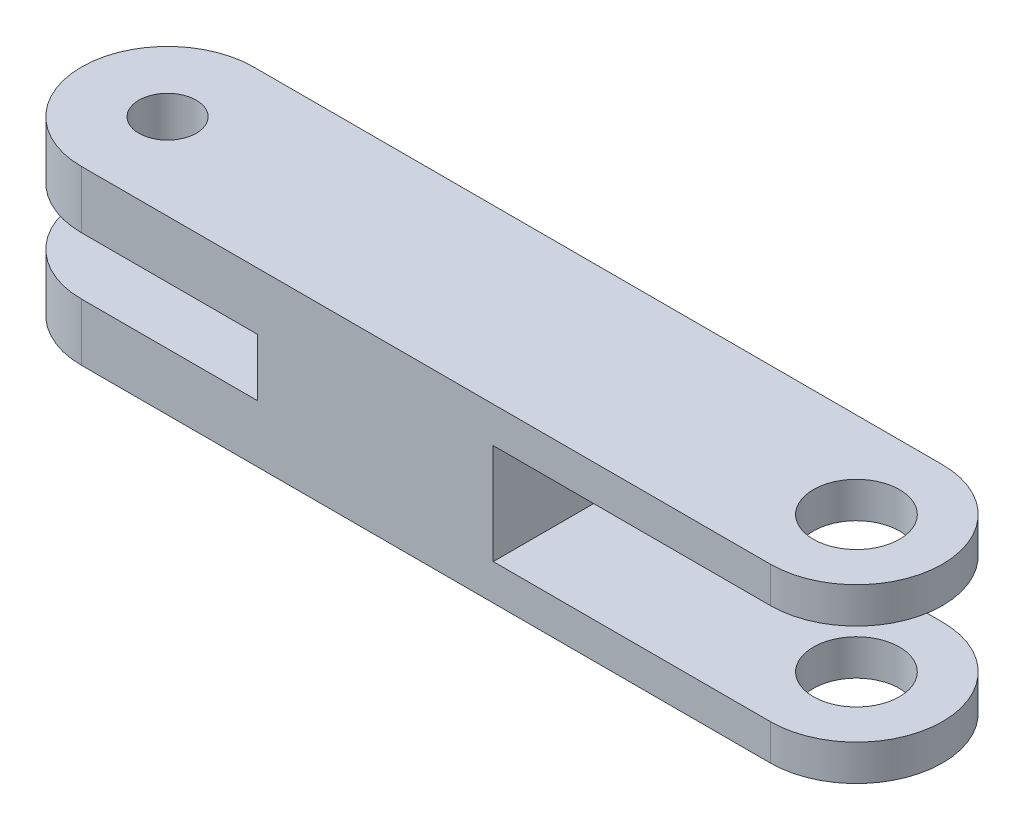
ISO-10303-21;
HEADER;
FILE_DESCRIPTION(('STEP AP214'),'2;1');
FILE_NAME('part.step','',(''),(''),'','','');
FILE_SCHEMA(('AUTOMOTIVE_DESIGN { 1 0 10303 214 1 1 1 1 }'));
ENDSEC;
DATA;
#1=APPLICATION_CONTEXT('core data for automotive mechanical design processes');
#2=APPLICATION_PROTOCOL_DEFINITION('international standard','automotive_design',2000,#1);
#3=PRODUCT_CONTEXT('',#1,'mechanical');
#4=PRODUCT('Part','Part','',(#3));
#5=PRODUCT_RELATED_PRODUCT_CATEGORY('part','',(#4));
#6=PRODUCT_DEFINITION_FORMATION('','',#4);
#7=PRODUCT_DEFINITION_CONTEXT('part definition',#1,'design');
#8=PRODUCT_DEFINITION('design','',#6,#7);
#9=PRODUCT_DEFINITION_SHAPE('','',#8);
#10=(LENGTH_UNIT() NAMED_UNIT(*) SI_UNIT(.MILLI.,.METRE.));
#11=(NAMED_UNIT(*) PLANE_ANGLE_UNIT() SI_UNIT($,.RADIAN.));
#12=(NAMED_UNIT(*) SI_UNIT($,.STERADIAN.) SOLID_ANGLE_UNIT());
#13=UNCERTAINTY_MEASURE_WITH_UNIT(LENGTH_MEASURE(1.E-05),#10,'distance_accuracy_value','');
#14=(GEOMETRIC_REPRESENTATION_CONTEXT(3) GLOBAL_UNCERTAINTY_ASSIGNED_CONTEXT((#13)) GLOBAL_UNIT_ASSIGNED_CONTEXT((#10,
#11,#12)) REPRESENTATION_CONTEXT('',''));
#15=CARTESIAN_POINT('',(0.,0.,0.));
#16=DIRECTION('',(0.,0.,1.));
#17=DIRECTION('',(1.,0.,0.));
#18=AXIS2_PLACEMENT_3D('',#15,#16,#17);
#19=CARTESIAN_POINT('',(0.,3.,0.));
#20=DIRECTION('',(0.,-1.,0.));
#21=DIRECTION('',(0.,0.,-1.));
#22=AXIS2_PLACEMENT_3D('',#19,#20,#21);
#23=CYLINDRICAL_SURFACE('',#22,3.);
#24=CARTESIAN_POINT('',(0.,1.,0.));
#25=DIRECTION('',(0.,-1.,0.));
#26=DIRECTION('',(0.,0.,-1.));
#27=AXIS2_PLACEMENT_3D('',#24,#25,#26);
#28=CIRCLE('',#27,3.);
#29=CARTESIAN_POINT('',(0.,1.,3.));
#30=VERTEX_POINT('',#29);
#31=CARTESIAN_POINT('',(0.,1.,-3.));
#32=VERTEX_POINT('',#31);
#33=EDGE_CURVE('E153',#30,#32,#28,.T.);
#34=ORIENTED_EDGE('',*,*,#33,.F.);
#35=DIRECTION('',(0.,-1.,0.));
#36=VECTOR('',#35,1.);
#37=CARTESIAN_POINT('',(0.,3.,3.));
#38=LINE('',#37,#36);
#39=CARTESIAN_POINT('',(0.,3.,3.));
#40=VERTEX_POINT('',#39);
#41=EDGE_CURVE('E148',#40,#30,#38,.T.);
#42=ORIENTED_EDGE('',*,*,#41,.F.);
#43=CARTESIAN_POINT('',(0.,3.,0.));
#44=DIRECTION('',(0.,1.,0.));
#45=DIRECTION('',(0.,0.,1.));
#46=AXIS2_PLACEMENT_3D('',#43,#44,#45);
#47=CIRCLE('',#46,3.);
#48=CARTESIAN_POINT('',(0.,3.,-3.));
#49=VERTEX_POINT('',#48);
#50=EDGE_CURVE('E200',#49,#40,#47,.T.);
#51=ORIENTED_EDGE('',*,*,#50,.F.);
#52=DIRECTION('',(0.,-1.,0.));
#53=VECTOR('',#52,1.);
#54=CARTESIAN_POINT('',(0.,3.,-3.));
#55=LINE('',#54,#53);
#56=EDGE_CURVE('E221',#49,#32,#55,.T.);
#57=ORIENTED_EDGE('',*,*,#56,.T.);
#58=EDGE_LOOP('',(#34,#42,#51,#57));
#59=FACE_BOUND('',#58,.T.);
#60=ADVANCED_FACE('F41',(#59),#23,.T.);
#61=CARTESIAN_POINT('',(0.,3.,0.));
#62=DIRECTION('',(0.,-1.,0.));
#63=DIRECTION('',(0.,0.,-1.));
#64=AXIS2_PLACEMENT_3D('',#61,#62,#63);
#65=CYLINDRICAL_SURFACE('',#64,1.);
#66=CARTESIAN_POINT('',(0.,3.,0.));
#67=DIRECTION('',(0.,1.,0.));
#68=DIRECTION('',(0.,0.,1.));
#69=AXIS2_PLACEMENT_3D('',#66,#67,#68);
#70=CIRCLE('',#69,1.);
#71=CARTESIAN_POINT('',(0.,3.,1.));
#72=VERTEX_POINT('',#71);
#73=EDGE_CURVE('E188',#72,#72,#70,.T.);
#74=ORIENTED_EDGE('',*,*,#73,.T.);
#75=EDGE_LOOP('',(#74));
#76=FACE_BOUND('',#75,.T.);
#77=CARTESIAN_POINT('',(0.,1.,0.));
#78=DIRECTION('',(0.,-1.,0.));
#79=DIRECTION('',(0.,0.,-1.));
#80=AXIS2_PLACEMENT_3D('',#77,#78,#79);
#81=CIRCLE('',#80,1.);
#82=CARTESIAN_POINT('',(0.,1.,-1.));
#83=VERTEX_POINT('',#82);
#84=EDGE_CURVE('E240',#83,#83,#81,.T.);
#85=ORIENTED_EDGE('',*,*,#84,.T.);
#86=EDGE_LOOP('',(#85));
#87=FACE_BOUND('',#86,.T.);
#88=ADVANCED_FACE('F285',(#76,#87),#65,.F.);
#89=CARTESIAN_POINT('',(0.,3.,3.));
#90=DIRECTION('',(0.,0.,-1.));
#91=DIRECTION('',(-1.,0.,0.));
#92=AXIS2_PLACEMENT_3D('',#89,#90,#91);
#93=PLANE('',#92);
#94=DIRECTION('',(0.,-1.,0.));
#95=VECTOR('',#94,1.);
#96=CARTESIAN_POINT('',(6.13903412950462,3.,3.));
#97=LINE('',#96,#95);
#98=CARTESIAN_POINT('',(6.13903412950462,1.,3.));
#99=VERTEX_POINT('',#98);
#100=CARTESIAN_POINT('',(6.13903412950462,-1.,3.));
#101=VERTEX_POINT('',#100);
#102=EDGE_CURVE('E132',#99,#101,#97,.T.);
#103=ORIENTED_EDGE('',*,*,#102,.T.);
#104=DIRECTION('',(-1.,0.,0.));
#105=VECTOR('',#104,1.);
#106=CARTESIAN_POINT('',(0.,-1.,3.));
#107=LINE('',#106,#105);
#108=CARTESIAN_POINT('',(0.,-1.,3.));
#109=VERTEX_POINT('',#108);
#110=EDGE_CURVE('E139',#101,#109,#107,.T.);
#111=ORIENTED_EDGE('',*,*,#110,.T.);
#112=CARTESIAN_POINT('',(0.,-3.,3.));
#113=VERTEX_POINT('',#112);
#114=EDGE_CURVE('E232',#109,#113,#38,.T.);
#115=ORIENTED_EDGE('',*,*,#114,.T.);
#116=DIRECTION('',(1.,0.,0.));
#117=VECTOR('',#116,1.);
#118=CARTESIAN_POINT('',(0.,-3.,3.));
#119=LINE('',#118,#117);
#120=CARTESIAN_POINT('',(24.,-3.,3.));
#121=VERTEX_POINT('',#120);
#122=EDGE_CURVE('E213',#113,#121,#119,.T.);
#123=ORIENTED_EDGE('',*,*,#122,.T.);
#124=DIRECTION('',(0.,-1.,0.));
#125=VECTOR('',#124,1.);
#126=CARTESIAN_POINT('',(24.,3.,3.));
#127=LINE('',#126,#125);
#128=CARTESIAN_POINT('',(24.,-1.75,3.));
#129=VERTEX_POINT('',#128);
#130=EDGE_CURVE('E228',#129,#121,#127,.T.);
#131=ORIENTED_EDGE('',*,*,#130,.F.);
#132=DIRECTION('',(1.,0.,0.));
#133=VECTOR('',#132,1.);
#134=CARTESIAN_POINT('',(0.,-1.75,3.));
#135=LINE('',#134,#133);
#136=CARTESIAN_POINT('',(14.3461409194115,-1.75,3.));
#137=VERTEX_POINT('',#136);
#138=EDGE_CURVE('E182',#137,#129,#135,.T.);
#139=ORIENTED_EDGE('',*,*,#138,.F.);
#140=DIRECTION('',(0.,1.,0.));
#141=VECTOR('',#140,1.);
#142=CARTESIAN_POINT('',(14.3461409194115,3.,3.));
#143=LINE('',#142,#141);
#144=CARTESIAN_POINT('',(14.3461409194115,1.75,3.));
#145=VERTEX_POINT('',#144);
#146=EDGE_CURVE('E184',#137,#145,#143,.T.);
#147=ORIENTED_EDGE('',*,*,#146,.T.);
#148=DIRECTION('',(1.,0.,0.));
#149=VECTOR('',#148,1.);
#150=CARTESIAN_POINT('',(0.,1.75,3.));
#151=LINE('',#150,#149);
#152=CARTESIAN_POINT('',(24.,1.75,3.));
#153=VERTEX_POINT('',#152);
#154=EDGE_CURVE('E174',#145,#153,#151,.T.);
#155=ORIENTED_EDGE('',*,*,#154,.T.);
#156=CARTESIAN_POINT('',(24.,3.,3.));
#157=VERTEX_POINT('',#156);
#158=EDGE_CURVE('E229',#157,#153,#127,.T.);
#159=ORIENTED_EDGE('',*,*,#158,.F.);
#160=DIRECTION('',(1.,0.,0.));
#161=VECTOR('',#160,1.);
#162=CARTESIAN_POINT('',(0.,3.,3.));
#163=LINE('',#162,#161);
#164=EDGE_CURVE('E203',#40,#157,#163,.T.);
#165=ORIENTED_EDGE('',*,*,#164,.F.);
#166=ORIENTED_EDGE('',*,*,#41,.T.);
#167=DIRECTION('',(-1.,0.,0.));
#168=VECTOR('',#167,1.);
#169=CARTESIAN_POINT('',(0.,1.,3.));
#170=LINE('',#169,#168);
#171=EDGE_CURVE('E56',#99,#30,#170,.T.);
#172=ORIENTED_EDGE('',*,*,#171,.F.);
#173=EDGE_LOOP('',(#103,#111,#115,#123,#131,#139,#147,#155,#159,#165,#166,#172));
#174=FACE_BOUND('',#173,.T.);
#175=ADVANCED_FACE('F146',(#174),#93,.F.);
#176=CARTESIAN_POINT('',(24.,3.,0.));
#177=DIRECTION('',(0.,-1.,0.));
#178=DIRECTION('',(0.,0.,-1.));
#179=AXIS2_PLACEMENT_3D('',#176,#177,#178);
#180=CYLINDRICAL_SURFACE('',#179,3.);
#181=CARTESIAN_POINT('',(24.,-1.75,0.));
#182=DIRECTION('',(0.,1.,0.));
#183=DIRECTION('',(0.,0.,1.));
#184=AXIS2_PLACEMENT_3D('',#181,#182,#183);
#185=CIRCLE('',#184,3.);
#186=CARTESIAN_POINT('',(24.,-1.75,-3.));
#187=VERTEX_POINT('',#186);
#188=EDGE_CURVE('E180',#129,#187,#185,.T.);
#189=ORIENTED_EDGE('',*,*,#188,.F.);
#190=ORIENTED_EDGE('',*,*,#130,.T.);
#191=CARTESIAN_POINT('',(24.,-3.,0.));
#192=DIRECTION('',(0.,1.,0.));
#193=DIRECTION('',(0.,0.,1.));
#194=AXIS2_PLACEMENT_3D('',#191,#192,#193);
#195=CIRCLE('',#194,3.);
#196=CARTESIAN_POINT('',(24.,-3.,-3.));
#197=VERTEX_POINT('',#196);
#198=EDGE_CURVE('E216',#121,#197,#195,.T.);
#199=ORIENTED_EDGE('',*,*,#198,.T.);
#200=DIRECTION('',(0.,-1.,0.));
#201=VECTOR('',#200,1.);
#202=CARTESIAN_POINT('',(24.,3.,-3.));
#203=LINE('',#202,#201);
#204=EDGE_CURVE('E224',#187,#197,#203,.T.);
#205=ORIENTED_EDGE('',*,*,#204,.F.);
#206=EDGE_LOOP('',(#189,#190,#199,#205));
#207=FACE_BOUND('',#206,.T.);
#208=ADVANCED_FACE('F263',(#207),#180,.T.);
#209=CARTESIAN_POINT('',(0.,3.,-3.));
#210=DIRECTION('',(0.,0.,1.));
#211=DIRECTION('',(1.,0.,0.));
#212=AXIS2_PLACEMENT_3D('',#209,#210,#211);
#213=PLANE('',#212);
#214=CARTESIAN_POINT('',(0.,-1.,-3.));
#215=VERTEX_POINT('',#214);
#216=CARTESIAN_POINT('',(0.,-3.,-3.));
#217=VERTEX_POINT('',#216);
#218=EDGE_CURVE('E210',#215,#217,#55,.T.);
#219=ORIENTED_EDGE('',*,*,#218,.F.);
#220=DIRECTION('',(1.,0.,0.));
#221=VECTOR('',#220,1.);
#222=CARTESIAN_POINT('',(0.,-1.,-3.));
#223=LINE('',#222,#221);
#224=CARTESIAN_POINT('',(6.13903412950462,-1.,-3.));
#225=VERTEX_POINT('',#224);
#226=EDGE_CURVE('E159',#215,#225,#223,.T.);
#227=ORIENTED_EDGE('',*,*,#226,.T.);
#228=DIRECTION('',(0.,1.,0.));
#229=VECTOR('',#228,1.);
#230=CARTESIAN_POINT('',(6.13903412950462,3.,-3.));
#231=LINE('',#230,#229);
#232=CARTESIAN_POINT('',(6.13903412950462,1.,-3.));
#233=VERTEX_POINT('',#232);
#234=EDGE_CURVE('E11',#225,#233,#231,.T.);
#235=ORIENTED_EDGE('',*,*,#234,.T.);
#236=DIRECTION('',(1.,0.,0.));
#237=VECTOR('',#236,1.);
#238=CARTESIAN_POINT('',(0.,1.,-3.));
#239=LINE('',#238,#237);
#240=EDGE_CURVE('E143',#32,#233,#239,.T.);
#241=ORIENTED_EDGE('',*,*,#240,.F.);
#242=ORIENTED_EDGE('',*,*,#56,.F.);
#243=DIRECTION('',(-1.,0.,0.));
#244=VECTOR('',#243,1.);
#245=CARTESIAN_POINT('',(0.,3.,-3.));
#246=LINE('',#245,#244);
#247=CARTESIAN_POINT('',(24.,3.,-3.));
#248=VERTEX_POINT('',#247);
#249=EDGE_CURVE('E208',#248,#49,#246,.T.);
#250=ORIENTED_EDGE('',*,*,#249,.F.);
#251=CARTESIAN_POINT('',(24.,1.75,-3.));
#252=VERTEX_POINT('',#251);
#253=EDGE_CURVE('E225',#248,#252,#203,.T.);
#254=ORIENTED_EDGE('',*,*,#253,.T.);
#255=DIRECTION('',(-1.,0.,0.));
#256=VECTOR('',#255,1.);
#257=CARTESIAN_POINT('',(0.,1.75,-3.));
#258=LINE('',#257,#256);
#259=CARTESIAN_POINT('',(14.3461409194115,1.75,-3.));
#260=VERTEX_POINT('',#259);
#261=EDGE_CURVE('E168',#252,#260,#258,.T.);
#262=ORIENTED_EDGE('',*,*,#261,.T.);
#263=DIRECTION('',(0.,-1.,0.));
#264=VECTOR('',#263,1.);
#265=CARTESIAN_POINT('',(14.3461409194115,3.,-3.));
#266=LINE('',#265,#264);
#267=CARTESIAN_POINT('',(14.3461409194115,-1.75,-3.));
#268=VERTEX_POINT('',#267);
#269=EDGE_CURVE('E49',#260,#268,#266,.T.);
#270=ORIENTED_EDGE('',*,*,#269,.T.);
#271=DIRECTION('',(-1.,0.,0.));
#272=VECTOR('',#271,1.);
#273=CARTESIAN_POINT('',(0.,-1.75,-3.));
#274=LINE('',#273,#272);
#275=EDGE_CURVE('E178',#187,#268,#274,.T.);
#276=ORIENTED_EDGE('',*,*,#275,.F.);
#277=ORIENTED_EDGE('',*,*,#204,.T.);
#278=DIRECTION('',(-1.,0.,0.));
#279=VECTOR('',#278,1.);
#280=CARTESIAN_POINT('',(0.,-3.,-3.));
#281=LINE('',#280,#279);
#282=EDGE_CURVE('E204',#197,#217,#281,.T.);
#283=ORIENTED_EDGE('',*,*,#282,.T.);
#284=EDGE_LOOP('',(#219,#227,#235,#241,#242,#250,#254,#262,#270,#276,#277,#283));
#285=FACE_BOUND('',#284,.T.);
#286=ADVANCED_FACE('F249',(#285),#213,.F.);
#287=CARTESIAN_POINT('',(24.,3.,0.));
#288=DIRECTION('',(0.,-1.,0.));
#289=DIRECTION('',(0.,0.,-1.));
#290=AXIS2_PLACEMENT_3D('',#287,#288,#289);
#291=CYLINDRICAL_SURFACE('',#290,1.5);
#292=CARTESIAN_POINT('',(24.,-3.,0.));
#293=DIRECTION('',(0.,1.,0.));
#294=DIRECTION('',(0.,0.,1.));
#295=AXIS2_PLACEMENT_3D('',#292,#293,#294);
#296=CIRCLE('',#295,1.5);
#297=CARTESIAN_POINT('',(24.,-3.,1.5));
#298=VERTEX_POINT('',#297);
#299=EDGE_CURVE('E191',#298,#298,#296,.T.);
#300=ORIENTED_EDGE('',*,*,#299,.F.);
#301=EDGE_LOOP('',(#300));
#302=FACE_BOUND('',#301,.T.);
#303=CARTESIAN_POINT('',(24.,-1.75,0.));
#304=DIRECTION('',(0.,1.,0.));
#305=DIRECTION('',(0.,0.,1.));
#306=AXIS2_PLACEMENT_3D('',#303,#304,#305);
#307=CIRCLE('',#306,1.5);
#308=CARTESIAN_POINT('',(24.,-1.75,1.5));
#309=VERTEX_POINT('',#308);
#310=EDGE_CURVE('E177',#309,#309,#307,.T.);
#311=ORIENTED_EDGE('',*,*,#310,.T.);
#312=EDGE_LOOP('',(#311));
#313=FACE_BOUND('',#312,.T.);
#314=ADVANCED_FACE('F307',(#302,#313),#291,.F.);
#315=CARTESIAN_POINT('',(0.,3.,0.));
#316=DIRECTION('',(0.,1.,0.));
#317=DIRECTION('',(0.,0.,1.));
#318=AXIS2_PLACEMENT_3D('',#315,#316,#317);
#319=PLANE('',#318);
#320=CARTESIAN_POINT('',(24.,3.,0.));
#321=DIRECTION('',(0.,1.,0.));
#322=DIRECTION('',(0.,0.,1.));
#323=AXIS2_PLACEMENT_3D('',#320,#321,#322);
#324=CIRCLE('',#323,1.5);
#325=CARTESIAN_POINT('',(24.,3.,1.5));
#326=VERTEX_POINT('',#325);
#327=EDGE_CURVE('E194',#326,#326,#324,.T.);
#328=ORIENTED_EDGE('',*,*,#327,.F.);
#329=EDGE_LOOP('',(#328));
#330=FACE_BOUND('',#329,.T.);
#331=ORIENTED_EDGE('',*,*,#50,.T.);
#332=ORIENTED_EDGE('',*,*,#164,.T.);
#333=CARTESIAN_POINT('',(24.,3.,0.));
#334=DIRECTION('',(0.,1.,0.));
#335=DIRECTION('',(0.,0.,1.));
#336=AXIS2_PLACEMENT_3D('',#333,#334,#335);
#337=CIRCLE('',#336,3.);
#338=EDGE_CURVE('E206',#157,#248,#337,.T.);
#339=ORIENTED_EDGE('',*,*,#338,.T.);
#340=ORIENTED_EDGE('',*,*,#249,.T.);
#341=EDGE_LOOP('',(#331,#332,#339,#340));
#342=FACE_BOUND('',#341,.T.);
#343=ORIENTED_EDGE('',*,*,#73,.F.);
#344=EDGE_LOOP('',(#343));
#345=FACE_BOUND('',#344,.T.);
#346=ADVANCED_FACE('F280',(#330,#342,#345),#319,.T.);
#347=CARTESIAN_POINT('',(0.,-3.,0.));
#348=DIRECTION('',(0.,1.,0.));
#349=DIRECTION('',(0.,0.,1.));
#350=AXIS2_PLACEMENT_3D('',#347,#348,#349);
#351=PLANE('',#350);
#352=CARTESIAN_POINT('',(0.,-3.,0.));
#353=DIRECTION('',(0.,1.,0.));
#354=DIRECTION('',(0.,0.,1.));
#355=AXIS2_PLACEMENT_3D('',#352,#353,#354);
#356=CIRCLE('',#355,3.);
#357=EDGE_CURVE('E197',#217,#113,#356,.T.);
#358=ORIENTED_EDGE('',*,*,#357,.F.);
#359=ORIENTED_EDGE('',*,*,#282,.F.);
#360=ORIENTED_EDGE('',*,*,#198,.F.);
#361=ORIENTED_EDGE('',*,*,#122,.F.);
#362=EDGE_LOOP('',(#358,#359,#360,#361));
#363=FACE_BOUND('',#362,.T.);
#364=ORIENTED_EDGE('',*,*,#299,.T.);
#365=EDGE_LOOP('',(#364));
#366=FACE_BOUND('',#365,.T.);
#367=CARTESIAN_POINT('',(0.,-3.,0.));
#368=DIRECTION('',(0.,1.,0.));
#369=DIRECTION('',(0.,0.,1.));
#370=AXIS2_PLACEMENT_3D('',#367,#368,#369);
#371=CIRCLE('',#370,1.);
#372=CARTESIAN_POINT('',(0.,-3.,1.));
#373=VERTEX_POINT('',#372);
#374=EDGE_CURVE('E187',#373,#373,#371,.T.);
#375=ORIENTED_EDGE('',*,*,#374,.T.);
#376=EDGE_LOOP('',(#375));
#377=FACE_BOUND('',#376,.T.);
#378=ADVANCED_FACE('F258',(#363,#366,#377),#351,.F.);
#379=ORIENTED_EDGE('',*,*,#114,.F.);
#380=CARTESIAN_POINT('',(0.,-1.,0.));
#381=DIRECTION('',(0.,-1.,0.));
#382=DIRECTION('',(0.,0.,-1.));
#383=AXIS2_PLACEMENT_3D('',#380,#381,#382);
#384=CIRCLE('',#383,3.);
#385=EDGE_CURVE('E152',#109,#215,#384,.T.);
#386=ORIENTED_EDGE('',*,*,#385,.T.);
#387=ORIENTED_EDGE('',*,*,#218,.T.);
#388=ORIENTED_EDGE('',*,*,#357,.T.);
#389=EDGE_LOOP('',(#379,#386,#387,#388));
#390=FACE_BOUND('',#389,.T.);
#391=ADVANCED_FACE('F43',(#390),#23,.T.);
#392=ORIENTED_EDGE('',*,*,#158,.T.);
#393=CARTESIAN_POINT('',(24.,1.75,0.));
#394=DIRECTION('',(0.,1.,0.));
#395=DIRECTION('',(0.,0.,1.));
#396=AXIS2_PLACEMENT_3D('',#393,#394,#395);
#397=CIRCLE('',#396,3.);
#398=EDGE_CURVE('E171',#153,#252,#397,.T.);
#399=ORIENTED_EDGE('',*,*,#398,.T.);
#400=ORIENTED_EDGE('',*,*,#253,.F.);
#401=ORIENTED_EDGE('',*,*,#338,.F.);
#402=EDGE_LOOP('',(#392,#399,#400,#401));
#403=FACE_BOUND('',#402,.T.);
#404=ADVANCED_FACE('F275',(#403),#180,.T.);
#405=CARTESIAN_POINT('',(24.,1.75,0.));
#406=DIRECTION('',(0.,1.,0.));
#407=DIRECTION('',(0.,0.,1.));
#408=AXIS2_PLACEMENT_3D('',#405,#406,#407);
#409=CIRCLE('',#408,1.5);
#410=CARTESIAN_POINT('',(24.,1.75,1.5));
#411=VERTEX_POINT('',#410);
#412=EDGE_CURVE('E166',#411,#411,#409,.T.);
#413=ORIENTED_EDGE('',*,*,#412,.F.);
#414=EDGE_LOOP('',(#413));
#415=FACE_BOUND('',#414,.T.);
#416=ORIENTED_EDGE('',*,*,#327,.T.);
#417=EDGE_LOOP('',(#416));
#418=FACE_BOUND('',#417,.T.);
#419=ADVANCED_FACE('F299',(#415,#418),#291,.F.);
#420=CARTESIAN_POINT('',(0.,-1.,0.));
#421=DIRECTION('',(0.,-1.,0.));
#422=DIRECTION('',(0.,0.,-1.));
#423=AXIS2_PLACEMENT_3D('',#420,#421,#422);
#424=CIRCLE('',#423,1.);
#425=CARTESIAN_POINT('',(0.,-1.,-1.));
#426=VERTEX_POINT('',#425);
#427=EDGE_CURVE('E149',#426,#426,#424,.T.);
#428=ORIENTED_EDGE('',*,*,#427,.F.);
#429=EDGE_LOOP('',(#428));
#430=FACE_BOUND('',#429,.T.);
#431=ORIENTED_EDGE('',*,*,#374,.F.);
#432=EDGE_LOOP('',(#431));
#433=FACE_BOUND('',#432,.T.);
#434=ADVANCED_FACE('F292',(#430,#433),#65,.F.);
#435=CARTESIAN_POINT('',(14.3461409194115,-1.75,-7.84320747138726));
#436=DIRECTION('',(-1.,0.,0.));
#437=DIRECTION('',(0.,0.,1.));
#438=AXIS2_PLACEMENT_3D('',#435,#436,#437);
#439=PLANE('',#438);
#440=DIRECTION('',(0.,0.,1.));
#441=VECTOR('',#440,1.);
#442=CARTESIAN_POINT('',(14.3461409194115,-1.75,-7.84320747138726));
#443=LINE('',#442,#441);
#444=EDGE_CURVE('E163',#268,#137,#443,.T.);
#445=ORIENTED_EDGE('',*,*,#444,.F.);
#446=ORIENTED_EDGE('',*,*,#269,.F.);
#447=DIRECTION('',(0.,0.,1.));
#448=VECTOR('',#447,1.);
#449=CARTESIAN_POINT('',(14.3461409194115,1.75,-7.84320747138726));
#450=LINE('',#449,#448);
#451=EDGE_CURVE('E64',#260,#145,#450,.T.);
#452=ORIENTED_EDGE('',*,*,#451,.T.);
#453=ORIENTED_EDGE('',*,*,#146,.F.);
#454=EDGE_LOOP('',(#445,#446,#452,#453));
#455=FACE_BOUND('',#454,.T.);
#456=ADVANCED_FACE('F270',(#455),#439,.F.);
#457=CARTESIAN_POINT('',(0.,-1.75,0.));
#458=DIRECTION('',(0.,1.,0.));
#459=DIRECTION('',(0.,0.,1.));
#460=AXIS2_PLACEMENT_3D('',#457,#458,#459);
#461=PLANE('',#460);
#462=ORIENTED_EDGE('',*,*,#310,.F.);
#463=EDGE_LOOP('',(#462));
#464=FACE_BOUND('',#463,.T.);
#465=ORIENTED_EDGE('',*,*,#138,.T.);
#466=ORIENTED_EDGE('',*,*,#188,.T.);
#467=ORIENTED_EDGE('',*,*,#275,.T.);
#468=ORIENTED_EDGE('',*,*,#444,.T.);
#469=EDGE_LOOP('',(#465,#466,#467,#468));
#470=FACE_BOUND('',#469,.T.);
#471=ADVANCED_FACE('F266',(#464,#470),#461,.T.);
#472=CARTESIAN_POINT('',(0.,1.75,0.));
#473=DIRECTION('',(0.,1.,0.));
#474=DIRECTION('',(0.,0.,1.));
#475=AXIS2_PLACEMENT_3D('',#472,#473,#474);
#476=PLANE('',#475);
#477=ORIENTED_EDGE('',*,*,#412,.T.);
#478=EDGE_LOOP('',(#477));
#479=FACE_BOUND('',#478,.T.);
#480=ORIENTED_EDGE('',*,*,#451,.F.);
#481=ORIENTED_EDGE('',*,*,#261,.F.);
#482=ORIENTED_EDGE('',*,*,#398,.F.);
#483=ORIENTED_EDGE('',*,*,#154,.F.);
#484=EDGE_LOOP('',(#480,#481,#482,#483));
#485=FACE_BOUND('',#484,.T.);
#486=ADVANCED_FACE('F273',(#479,#485),#476,.F.);
#487=CARTESIAN_POINT('',(6.13903412950462,-1.,-5.03584344586886));
#488=DIRECTION('',(1.,0.,0.));
#489=DIRECTION('',(0.,0.,-1.));
#490=AXIS2_PLACEMENT_3D('',#487,#488,#489);
#491=PLANE('',#490);
#492=DIRECTION('',(0.,0.,-1.));
#493=VECTOR('',#492,1.);
#494=CARTESIAN_POINT('',(6.13903412950462,1.,-5.03584344586886));
#495=LINE('',#494,#493);
#496=EDGE_CURVE('E134',#99,#233,#495,.T.);
#497=ORIENTED_EDGE('',*,*,#496,.T.);
#498=ORIENTED_EDGE('',*,*,#234,.F.);
#499=DIRECTION('',(0.,0.,-1.));
#500=VECTOR('',#499,1.);
#501=CARTESIAN_POINT('',(6.13903412950462,-1.,-5.03584344586886));
#502=LINE('',#501,#500);
#503=EDGE_CURVE('E136',#101,#225,#502,.T.);
#504=ORIENTED_EDGE('',*,*,#503,.F.);
#505=ORIENTED_EDGE('',*,*,#102,.F.);
#506=EDGE_LOOP('',(#497,#498,#504,#505));
#507=FACE_BOUND('',#506,.T.);
#508=ADVANCED_FACE('F133',(#507),#491,.F.);
#509=CARTESIAN_POINT('',(0.,-1.,0.));
#510=DIRECTION('',(0.,-1.,0.));
#511=DIRECTION('',(0.,0.,-1.));
#512=AXIS2_PLACEMENT_3D('',#509,#510,#511);
#513=PLANE('',#512);
#514=ORIENTED_EDGE('',*,*,#427,.T.);
#515=EDGE_LOOP('',(#514));
#516=FACE_BOUND('',#515,.T.);
#517=ORIENTED_EDGE('',*,*,#503,.T.);
#518=ORIENTED_EDGE('',*,*,#226,.F.);
#519=ORIENTED_EDGE('',*,*,#385,.F.);
#520=ORIENTED_EDGE('',*,*,#110,.F.);
#521=EDGE_LOOP('',(#517,#518,#519,#520));
#522=FACE_BOUND('',#521,.T.);
#523=ADVANCED_FACE('F246',(#516,#522),#513,.F.);
#524=CARTESIAN_POINT('',(0.,1.,0.));
#525=DIRECTION('',(0.,-1.,0.));
#526=DIRECTION('',(0.,0.,-1.));
#527=AXIS2_PLACEMENT_3D('',#524,#525,#526);
#528=PLANE('',#527);
#529=ORIENTED_EDGE('',*,*,#84,.F.);
#530=EDGE_LOOP('',(#529));
#531=FACE_BOUND('',#530,.T.);
#532=ORIENTED_EDGE('',*,*,#171,.T.);
#533=ORIENTED_EDGE('',*,*,#33,.T.);
#534=ORIENTED_EDGE('',*,*,#240,.T.);
#535=ORIENTED_EDGE('',*,*,#496,.F.);
#536=EDGE_LOOP('',(#532,#533,#534,#535));
#537=FACE_BOUND('',#536,.T.);
#538=ADVANCED_FACE('F141',(#531,#537),#528,.T.);
#539=CLOSED_SHELL('',(#60,#88,#175,#208,#286,#314,#346,#378,#391,#404,#419,#434,#456,#471,#486,
#508,#523,#538));
#540=MANIFOLD_SOLID_BREP('B2',#539);
#541=ADVANCED_BREP_SHAPE_REPRESENTATION('',(#18,#540),#14);
#542=SHAPE_DEFINITION_REPRESENTATION(#9,#541);
ENDSEC;
END-ISO-10303-21;
